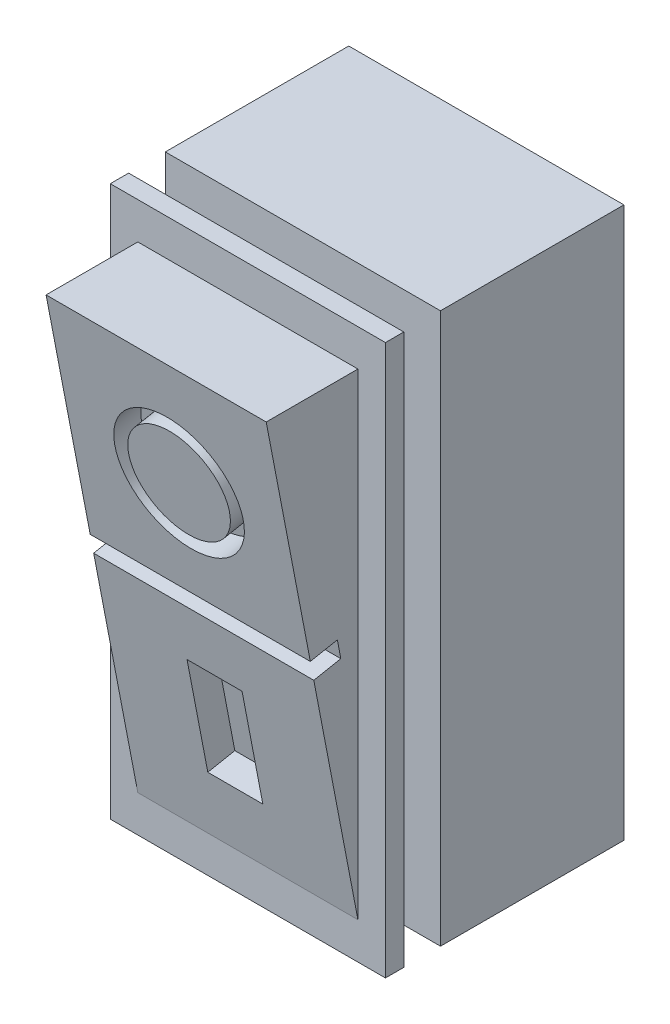
ISO-10303-21;
HEADER;
FILE_DESCRIPTION(('STEP AP214'),'2;1');
FILE_NAME('part.step','',(''),(''),'','','');
FILE_SCHEMA(('AUTOMOTIVE_DESIGN { 1 0 10303 214 1 1 1 1 }'));
ENDSEC;
DATA;
#1=APPLICATION_CONTEXT('core data for automotive mechanical design processes');
#2=APPLICATION_PROTOCOL_DEFINITION('international standard','automotive_design',2000,#1);
#3=PRODUCT_CONTEXT('',#1,'mechanical');
#4=PRODUCT('Part','Part','',(#3));
#5=PRODUCT_RELATED_PRODUCT_CATEGORY('part','',(#4));
#6=PRODUCT_DEFINITION_FORMATION('','',#4);
#7=PRODUCT_DEFINITION_CONTEXT('part definition',#1,'design');
#8=PRODUCT_DEFINITION('design','',#6,#7);
#9=PRODUCT_DEFINITION_SHAPE('','',#8);
#10=(LENGTH_UNIT() NAMED_UNIT(*) SI_UNIT(.MILLI.,.METRE.));
#11=(NAMED_UNIT(*) PLANE_ANGLE_UNIT() SI_UNIT($,.RADIAN.));
#12=(NAMED_UNIT(*) SI_UNIT($,.STERADIAN.) SOLID_ANGLE_UNIT());
#13=UNCERTAINTY_MEASURE_WITH_UNIT(LENGTH_MEASURE(1.E-05),#10,'distance_accuracy_value','');
#14=(GEOMETRIC_REPRESENTATION_CONTEXT(3) GLOBAL_UNCERTAINTY_ASSIGNED_CONTEXT((#13)) GLOBAL_UNIT_ASSIGNED_CONTEXT((#10,
#11,#12)) REPRESENTATION_CONTEXT('',''));
#15=CARTESIAN_POINT('',(0.,0.,0.));
#16=DIRECTION('',(0.,0.,1.));
#17=DIRECTION('',(1.,0.,0.));
#18=AXIS2_PLACEMENT_3D('',#15,#16,#17);
#19=CARTESIAN_POINT('',(-6.,13.,18.));
#20=DIRECTION('',(0.,0.188847393650125,-0.982006446980647));
#21=DIRECTION('',(0.,0.982006446980647,0.188847393650125));
#22=AXIS2_PLACEMENT_3D('',#19,#20,#21);
#23=PLANE('',#22);
#24=CARTESIAN_POINT('',(0.,6.5,16.75));
#25=DIRECTION('',(0.,-0.188847393650124,0.982006446980647));
#26=DIRECTION('',(0.,-0.982006446980647,-0.188847393650124));
#27=AXIS2_PLACEMENT_3D('',#24,#25,#26);
#28=CIRCLE('',#27,3.5);
#29=CARTESIAN_POINT('',(0.,3.06297743556773,16.0890341222246));
#30=VERTEX_POINT('',#29);
#31=EDGE_CURVE('E215',#30,#30,#28,.T.);
#32=ORIENTED_EDGE('',*,*,#31,.F.);
#33=EDGE_LOOP('',(#32));
#34=FACE_BOUND('',#33,.T.);
#35=DIRECTION('',(1.,0.,0.));
#36=VECTOR('',#35,1.);
#37=CARTESIAN_POINT('',(0.,0.491003223490321,15.5944236968251));
#38=LINE('',#37,#36);
#39=CARTESIAN_POINT('',(-6.,0.491003223490321,15.5944236968251));
#40=VERTEX_POINT('',#39);
#41=CARTESIAN_POINT('',(6.,0.491003223490321,15.5944236968251));
#42=VERTEX_POINT('',#41);
#43=EDGE_CURVE('E474',#40,#42,#38,.T.);
#44=ORIENTED_EDGE('',*,*,#43,.T.);
#45=DIRECTION('',(0.,0.982006446980647,0.188847393650125));
#46=VECTOR('',#45,1.);
#47=CARTESIAN_POINT('',(6.,13.,18.));
#48=LINE('',#47,#46);
#49=CARTESIAN_POINT('',(6.,13.,18.));
#50=VERTEX_POINT('',#49);
#51=EDGE_CURVE('E228',#42,#50,#48,.T.);
#52=ORIENTED_EDGE('',*,*,#51,.T.);
#53=DIRECTION('',(-1.,0.,0.));
#54=VECTOR('',#53,1.);
#55=CARTESIAN_POINT('',(-6.,13.,18.));
#56=LINE('',#55,#54);
#57=CARTESIAN_POINT('',(-6.,13.,18.));
#58=VERTEX_POINT('',#57);
#59=EDGE_CURVE('E239',#50,#58,#56,.T.);
#60=ORIENTED_EDGE('',*,*,#59,.T.);
#61=DIRECTION('',(0.,0.982006446980647,0.188847393650125));
#62=VECTOR('',#61,1.);
#63=CARTESIAN_POINT('',(-6.,13.,18.));
#64=LINE('',#63,#62);
#65=EDGE_CURVE('E235',#40,#58,#64,.T.);
#66=ORIENTED_EDGE('',*,*,#65,.F.);
#67=EDGE_LOOP('',(#44,#52,#60,#66));
#68=FACE_BOUND('',#67,.T.);
#69=ADVANCED_FACE('F33',(#34,#68),#23,.F.);
#70=CARTESIAN_POINT('',(6.,-13.,18.));
#71=DIRECTION('',(-1.,0.,0.));
#72=DIRECTION('',(0.,0.,1.));
#73=AXIS2_PLACEMENT_3D('',#70,#71,#72);
#74=PLANE('',#73);
#75=DIRECTION('',(0.,-0.188847393650125,0.982006446980647));
#76=VECTOR('',#75,1.);
#77=CARTESIAN_POINT('',(6.,0.774274313965508,14.1214140263541));
#78=LINE('',#77,#76);
#79=CARTESIAN_POINT('',(6.,0.774274313965508,14.1214140263541));
#80=VERTEX_POINT('',#79);
#81=EDGE_CURVE('E187',#80,#42,#78,.T.);
#82=ORIENTED_EDGE('',*,*,#81,.F.);
#83=DIRECTION('',(0.,0.982006446980647,0.188847393650124));
#84=VECTOR('',#83,1.);
#85=CARTESIAN_POINT('',(6.,-2.59119395945349,13.4742085891581));
#86=LINE('',#85,#84);
#87=CARTESIAN_POINT('',(6.,-0.207732133015141,13.932566632704));
#88=VERTEX_POINT('',#87);
#89=EDGE_CURVE('E173',#88,#80,#86,.T.);
#90=ORIENTED_EDGE('',*,*,#89,.F.);
#91=DIRECTION('',(0.,-0.188847393650125,0.982006446980647));
#92=VECTOR('',#91,1.);
#93=CARTESIAN_POINT('',(6.,-0.207732133015141,13.932566632704));
#94=LINE('',#93,#92);
#95=CARTESIAN_POINT('',(6.,-0.491003223490328,15.4055763031749));
#96=VERTEX_POINT('',#95);
#97=EDGE_CURVE('E171',#88,#96,#94,.T.);
#98=ORIENTED_EDGE('',*,*,#97,.T.);
#99=CARTESIAN_POINT('',(6.,-13.,13.));
#100=VERTEX_POINT('',#99);
#101=EDGE_CURVE('E236',#100,#96,#48,.T.);
#102=ORIENTED_EDGE('',*,*,#101,.F.);
#103=DIRECTION('',(0.,1.,0.));
#104=VECTOR('',#103,1.);
#105=CARTESIAN_POINT('',(6.,-13.,13.));
#106=LINE('',#105,#104);
#107=CARTESIAN_POINT('',(6.,13.,13.));
#108=VERTEX_POINT('',#107);
#109=EDGE_CURVE('E234',#100,#108,#106,.T.);
#110=ORIENTED_EDGE('',*,*,#109,.T.);
#111=DIRECTION('',(0.,0.,-1.));
#112=VECTOR('',#111,1.);
#113=CARTESIAN_POINT('',(6.,13.,18.));
#114=LINE('',#113,#112);
#115=EDGE_CURVE('E254',#50,#108,#114,.T.);
#116=ORIENTED_EDGE('',*,*,#115,.F.);
#117=ORIENTED_EDGE('',*,*,#51,.F.);
#118=EDGE_LOOP('',(#82,#90,#98,#102,#110,#116,#117));
#119=FACE_BOUND('',#118,.T.);
#120=ADVANCED_FACE('F360',(#119),#74,.F.);
#121=CARTESIAN_POINT('',(-6.,-13.,18.));
#122=DIRECTION('',(1.,0.,0.));
#123=DIRECTION('',(0.,0.,-1.));
#124=AXIS2_PLACEMENT_3D('',#121,#122,#123);
#125=PLANE('',#124);
#126=DIRECTION('',(0.,-0.188847393650125,0.982006446980647));
#127=VECTOR('',#126,1.);
#128=CARTESIAN_POINT('',(-6.,0.774274313965508,14.1214140263541));
#129=LINE('',#128,#127);
#130=CARTESIAN_POINT('',(-6.,0.774274313965506,14.1214140263541));
#131=VERTEX_POINT('',#130);
#132=EDGE_CURVE('E185',#131,#40,#129,.T.);
#133=ORIENTED_EDGE('',*,*,#132,.T.);
#134=ORIENTED_EDGE('',*,*,#65,.T.);
#135=DIRECTION('',(0.,0.,-1.));
#136=VECTOR('',#135,1.);
#137=CARTESIAN_POINT('',(-6.,13.,18.));
#138=LINE('',#137,#136);
#139=CARTESIAN_POINT('',(-6.,13.,13.));
#140=VERTEX_POINT('',#139);
#141=EDGE_CURVE('E242',#58,#140,#138,.T.);
#142=ORIENTED_EDGE('',*,*,#141,.T.);
#143=DIRECTION('',(0.,-1.,0.));
#144=VECTOR('',#143,1.);
#145=CARTESIAN_POINT('',(-6.,-13.,13.));
#146=LINE('',#145,#144);
#147=CARTESIAN_POINT('',(-6.,-13.,13.));
#148=VERTEX_POINT('',#147);
#149=EDGE_CURVE('E249',#140,#148,#146,.T.);
#150=ORIENTED_EDGE('',*,*,#149,.T.);
#151=CARTESIAN_POINT('',(-6.,-0.491003223490327,15.4055763031749));
#152=VERTEX_POINT('',#151);
#153=EDGE_CURVE('E184',#148,#152,#64,.T.);
#154=ORIENTED_EDGE('',*,*,#153,.T.);
#155=DIRECTION('',(0.,-0.188847393650125,0.982006446980647));
#156=VECTOR('',#155,1.);
#157=CARTESIAN_POINT('',(-6.,-0.20773213301514,13.932566632704));
#158=LINE('',#157,#156);
#159=CARTESIAN_POINT('',(-6.,-0.20773213301514,13.932566632704));
#160=VERTEX_POINT('',#159);
#161=EDGE_CURVE('E168',#160,#152,#158,.T.);
#162=ORIENTED_EDGE('',*,*,#161,.F.);
#163=DIRECTION('',(0.,-0.982006446980647,-0.188847393650124));
#164=VECTOR('',#163,1.);
#165=CARTESIAN_POINT('',(-6.,-2.59119395945349,13.4742085891581));
#166=LINE('',#165,#164);
#167=EDGE_CURVE('E174',#131,#160,#166,.T.);
#168=ORIENTED_EDGE('',*,*,#167,.F.);
#169=EDGE_LOOP('',(#133,#134,#142,#150,#154,#162,#168));
#170=FACE_BOUND('',#169,.T.);
#171=ADVANCED_FACE('F182',(#170),#125,.F.);
#172=ORIENTED_EDGE('',*,*,#101,.T.);
#173=DIRECTION('',(1.,0.,0.));
#174=VECTOR('',#173,1.);
#175=CARTESIAN_POINT('',(0.,-0.491003223490328,15.4055763031749));
#176=LINE('',#175,#174);
#177=EDGE_CURVE('E477',#152,#96,#176,.T.);
#178=ORIENTED_EDGE('',*,*,#177,.F.);
#179=ORIENTED_EDGE('',*,*,#153,.F.);
#180=DIRECTION('',(1.,0.,0.));
#181=VECTOR('',#180,1.);
#182=CARTESIAN_POINT('',(-6.,-13.,13.));
#183=LINE('',#182,#181);
#184=EDGE_CURVE('E243',#148,#100,#183,.T.);
#185=ORIENTED_EDGE('',*,*,#184,.T.);
#186=EDGE_LOOP('',(#172,#178,#179,#185));
#187=FACE_BOUND('',#186,.T.);
#188=DIRECTION('',(0.,0.982006446980647,0.188847393650124));
#189=VECTOR('',#188,1.);
#190=CARTESIAN_POINT('',(-1.5,-2.87446504992867,14.9472182596291));
#191=LINE('',#190,#189);
#192=CARTESIAN_POINT('',(-1.5,-9.44601934094194,13.6834578190496));
#193=VERTEX_POINT('',#192);
#194=CARTESIAN_POINT('',(-1.5,-3.55398065905806,14.8165421809504));
#195=VERTEX_POINT('',#194);
#196=EDGE_CURVE('E56',#193,#195,#191,.T.);
#197=ORIENTED_EDGE('',*,*,#196,.T.);
#198=DIRECTION('',(-1.,0.,0.));
#199=VECTOR('',#198,1.);
#200=CARTESIAN_POINT('',(0.,-3.55398065905806,14.8165421809504));
#201=LINE('',#200,#199);
#202=CARTESIAN_POINT('',(1.5,-3.55398065905806,14.8165421809504));
#203=VERTEX_POINT('',#202);
#204=EDGE_CURVE('E195',#203,#195,#201,.T.);
#205=ORIENTED_EDGE('',*,*,#204,.F.);
#206=DIRECTION('',(0.,0.982006446980647,0.188847393650124));
#207=VECTOR('',#206,1.);
#208=CARTESIAN_POINT('',(1.5,-2.87446504992867,14.9472182596291));
#209=LINE('',#208,#207);
#210=CARTESIAN_POINT('',(1.5,-9.44601934094194,13.6834578190496));
#211=VERTEX_POINT('',#210);
#212=EDGE_CURVE('E208',#211,#203,#209,.T.);
#213=ORIENTED_EDGE('',*,*,#212,.F.);
#214=DIRECTION('',(-1.,0.,0.));
#215=VECTOR('',#214,1.);
#216=CARTESIAN_POINT('',(0.,-9.44601934094194,13.6834578190496));
#217=LINE('',#216,#215);
#218=EDGE_CURVE('E205',#211,#193,#217,.T.);
#219=ORIENTED_EDGE('',*,*,#218,.T.);
#220=EDGE_LOOP('',(#197,#205,#213,#219));
#221=FACE_BOUND('',#220,.T.);
#222=ADVANCED_FACE('F364',(#187,#221),#23,.F.);
#223=CARTESIAN_POINT('',(0.,0.,13.));
#224=DIRECTION('',(0.,0.,-1.));
#225=DIRECTION('',(-1.,0.,0.));
#226=AXIS2_PLACEMENT_3D('',#223,#224,#225);
#227=PLANE('',#226);
#228=DIRECTION('',(0.,1.,0.));
#229=VECTOR('',#228,1.);
#230=CARTESIAN_POINT('',(7.5,-15.,13.));
#231=LINE('',#230,#229);
#232=CARTESIAN_POINT('',(7.5,-15.,13.));
#233=VERTEX_POINT('',#232);
#234=CARTESIAN_POINT('',(7.5,15.,13.));
#235=VERTEX_POINT('',#234);
#236=EDGE_CURVE('E258',#233,#235,#231,.T.);
#237=ORIENTED_EDGE('',*,*,#236,.T.);
#238=DIRECTION('',(-1.,0.,0.));
#239=VECTOR('',#238,1.);
#240=CARTESIAN_POINT('',(-7.5,15.,13.));
#241=LINE('',#240,#239);
#242=CARTESIAN_POINT('',(-7.5,15.,13.));
#243=VERTEX_POINT('',#242);
#244=EDGE_CURVE('E261',#235,#243,#241,.T.);
#245=ORIENTED_EDGE('',*,*,#244,.T.);
#246=DIRECTION('',(0.,-1.,0.));
#247=VECTOR('',#246,1.);
#248=CARTESIAN_POINT('',(-7.5,-15.,13.));
#249=LINE('',#248,#247);
#250=CARTESIAN_POINT('',(-7.5,-15.,13.));
#251=VERTEX_POINT('',#250);
#252=EDGE_CURVE('E264',#243,#251,#249,.T.);
#253=ORIENTED_EDGE('',*,*,#252,.T.);
#254=DIRECTION('',(1.,0.,0.));
#255=VECTOR('',#254,1.);
#256=CARTESIAN_POINT('',(-7.5,-15.,13.));
#257=LINE('',#256,#255);
#258=EDGE_CURVE('E266',#251,#233,#257,.T.);
#259=ORIENTED_EDGE('',*,*,#258,.T.);
#260=EDGE_LOOP('',(#237,#245,#253,#259));
#261=FACE_BOUND('',#260,.T.);
#262=ORIENTED_EDGE('',*,*,#109,.F.);
#263=ORIENTED_EDGE('',*,*,#184,.F.);
#264=ORIENTED_EDGE('',*,*,#149,.F.);
#265=DIRECTION('',(-1.,0.,0.));
#266=VECTOR('',#265,1.);
#267=CARTESIAN_POINT('',(-6.,13.,13.));
#268=LINE('',#267,#266);
#269=EDGE_CURVE('E246',#108,#140,#268,.T.);
#270=ORIENTED_EDGE('',*,*,#269,.F.);
#271=EDGE_LOOP('',(#262,#263,#264,#270));
#272=FACE_BOUND('',#271,.T.);
#273=ADVANCED_FACE('F340',(#261,#272),#227,.F.);
#274=CARTESIAN_POINT('',(0.,0.,10.));
#275=DIRECTION('',(0.,0.,-1.));
#276=DIRECTION('',(-1.,0.,0.));
#277=AXIS2_PLACEMENT_3D('',#274,#275,#276);
#278=PLANE('',#277);
#279=DIRECTION('',(0.,1.,0.));
#280=VECTOR('',#279,1.);
#281=CARTESIAN_POINT('',(7.5,-15.,10.));
#282=LINE('',#281,#280);
#283=CARTESIAN_POINT('',(7.5,-15.,10.));
#284=VERTEX_POINT('',#283);
#285=CARTESIAN_POINT('',(7.5,15.,10.));
#286=VERTEX_POINT('',#285);
#287=EDGE_CURVE('E291',#284,#286,#282,.T.);
#288=ORIENTED_EDGE('',*,*,#287,.T.);
#289=DIRECTION('',(-1.,0.,0.));
#290=VECTOR('',#289,1.);
#291=CARTESIAN_POINT('',(-7.5,15.,10.));
#292=LINE('',#291,#290);
#293=CARTESIAN_POINT('',(-7.5,15.,10.));
#294=VERTEX_POINT('',#293);
#295=EDGE_CURVE('E294',#286,#294,#292,.T.);
#296=ORIENTED_EDGE('',*,*,#295,.T.);
#297=DIRECTION('',(0.,-1.,0.));
#298=VECTOR('',#297,1.);
#299=CARTESIAN_POINT('',(-7.5,-15.,10.));
#300=LINE('',#299,#298);
#301=CARTESIAN_POINT('',(-7.5,-15.,10.));
#302=VERTEX_POINT('',#301);
#303=EDGE_CURVE('E297',#294,#302,#300,.T.);
#304=ORIENTED_EDGE('',*,*,#303,.T.);
#305=DIRECTION('',(1.,0.,0.));
#306=VECTOR('',#305,1.);
#307=CARTESIAN_POINT('',(-7.5,-15.,10.));
#308=LINE('',#307,#306);
#309=EDGE_CURVE('E299',#302,#284,#308,.T.);
#310=ORIENTED_EDGE('',*,*,#309,.T.);
#311=EDGE_LOOP('',(#288,#296,#304,#310));
#312=FACE_BOUND('',#311,.T.);
#313=CARTESIAN_POINT('',(0.,0.,10.));
#314=DIRECTION('',(0.,0.,-1.));
#315=DIRECTION('',(-1.,0.,0.));
#316=AXIS2_PLACEMENT_3D('',#313,#314,#315);
#317=CIRCLE('',#316,3.75);
#318=CARTESIAN_POINT('',(-3.75,0.,10.));
#319=VERTEX_POINT('',#318);
#320=EDGE_CURVE('E11',#319,#319,#317,.F.);
#321=ORIENTED_EDGE('',*,*,#320,.F.);
#322=EDGE_LOOP('',(#321));
#323=FACE_BOUND('',#322,.T.);
#324=ADVANCED_FACE('F337',(#312,#323),#278,.F.);
#325=CARTESIAN_POINT('',(7.5,-15.,10.));
#326=DIRECTION('',(-1.,0.,0.));
#327=DIRECTION('',(0.,-1.,0.));
#328=AXIS2_PLACEMENT_3D('',#325,#326,#327);
#329=PLANE('',#328);
#330=DIRECTION('',(0.,1.,0.));
#331=VECTOR('',#330,1.);
#332=CARTESIAN_POINT('',(7.5,-15.,0.));
#333=LINE('',#332,#331);
#334=CARTESIAN_POINT('',(7.5,-15.,0.));
#335=VERTEX_POINT('',#334);
#336=CARTESIAN_POINT('',(7.5,15.,0.));
#337=VERTEX_POINT('',#336);
#338=EDGE_CURVE('E290',#335,#337,#333,.T.);
#339=ORIENTED_EDGE('',*,*,#338,.T.);
#340=DIRECTION('',(0.,0.,-1.));
#341=VECTOR('',#340,1.);
#342=CARTESIAN_POINT('',(7.5,15.,10.));
#343=LINE('',#342,#341);
#344=EDGE_CURVE('E41',#286,#337,#343,.T.);
#345=ORIENTED_EDGE('',*,*,#344,.F.);
#346=ORIENTED_EDGE('',*,*,#287,.F.);
#347=DIRECTION('',(0.,0.,-1.));
#348=VECTOR('',#347,1.);
#349=CARTESIAN_POINT('',(7.5,-15.,10.));
#350=LINE('',#349,#348);
#351=EDGE_CURVE('E301',#284,#335,#350,.T.);
#352=ORIENTED_EDGE('',*,*,#351,.T.);
#353=EDGE_LOOP('',(#339,#345,#346,#352));
#354=FACE_BOUND('',#353,.T.);
#355=ADVANCED_FACE('F35',(#354),#329,.F.);
#356=CARTESIAN_POINT('',(-7.5,15.,10.));
#357=DIRECTION('',(0.,-1.,0.));
#358=DIRECTION('',(0.,0.,-1.));
#359=AXIS2_PLACEMENT_3D('',#356,#357,#358);
#360=PLANE('',#359);
#361=DIRECTION('',(-1.,0.,0.));
#362=VECTOR('',#361,1.);
#363=CARTESIAN_POINT('',(-7.5,15.,0.));
#364=LINE('',#363,#362);
#365=CARTESIAN_POINT('',(-7.5,15.,0.));
#366=VERTEX_POINT('',#365);
#367=EDGE_CURVE('E304',#337,#366,#364,.T.);
#368=ORIENTED_EDGE('',*,*,#367,.T.);
#369=DIRECTION('',(0.,0.,-1.));
#370=VECTOR('',#369,1.);
#371=CARTESIAN_POINT('',(-7.5,15.,10.));
#372=LINE('',#371,#370);
#373=EDGE_CURVE('E314',#294,#366,#372,.T.);
#374=ORIENTED_EDGE('',*,*,#373,.F.);
#375=ORIENTED_EDGE('',*,*,#295,.F.);
#376=ORIENTED_EDGE('',*,*,#344,.T.);
#377=EDGE_LOOP('',(#368,#374,#375,#376));
#378=FACE_BOUND('',#377,.T.);
#379=ADVANCED_FACE('F319',(#378),#360,.F.);
#380=CARTESIAN_POINT('',(-7.5,-15.,10.));
#381=DIRECTION('',(1.,0.,0.));
#382=DIRECTION('',(0.,0.,-1.));
#383=AXIS2_PLACEMENT_3D('',#380,#381,#382);
#384=PLANE('',#383);
#385=DIRECTION('',(0.,-1.,0.));
#386=VECTOR('',#385,1.);
#387=CARTESIAN_POINT('',(-7.5,-15.,0.));
#388=LINE('',#387,#386);
#389=CARTESIAN_POINT('',(-7.5,-15.,0.));
#390=VERTEX_POINT('',#389);
#391=EDGE_CURVE('E306',#366,#390,#388,.T.);
#392=ORIENTED_EDGE('',*,*,#391,.T.);
#393=DIRECTION('',(0.,0.,-1.));
#394=VECTOR('',#393,1.);
#395=CARTESIAN_POINT('',(-7.5,-15.,10.));
#396=LINE('',#395,#394);
#397=EDGE_CURVE('E311',#302,#390,#396,.T.);
#398=ORIENTED_EDGE('',*,*,#397,.F.);
#399=ORIENTED_EDGE('',*,*,#303,.F.);
#400=ORIENTED_EDGE('',*,*,#373,.T.);
#401=EDGE_LOOP('',(#392,#398,#399,#400));
#402=FACE_BOUND('',#401,.T.);
#403=ADVANCED_FACE('F331',(#402),#384,.F.);
#404=CARTESIAN_POINT('',(-7.5,-15.,10.));
#405=DIRECTION('',(0.,1.,0.));
#406=DIRECTION('',(0.,0.,1.));
#407=AXIS2_PLACEMENT_3D('',#404,#405,#406);
#408=PLANE('',#407);
#409=DIRECTION('',(1.,0.,0.));
#410=VECTOR('',#409,1.);
#411=CARTESIAN_POINT('',(-7.5,-15.,0.));
#412=LINE('',#411,#410);
#413=EDGE_CURVE('E295',#390,#335,#412,.T.);
#414=ORIENTED_EDGE('',*,*,#413,.T.);
#415=ORIENTED_EDGE('',*,*,#351,.F.);
#416=ORIENTED_EDGE('',*,*,#309,.F.);
#417=ORIENTED_EDGE('',*,*,#397,.T.);
#418=EDGE_LOOP('',(#414,#415,#416,#417));
#419=FACE_BOUND('',#418,.T.);
#420=ADVANCED_FACE('F335',(#419),#408,.F.);
#421=CARTESIAN_POINT('',(0.,0.,0.));
#422=DIRECTION('',(0.,0.,-1.));
#423=DIRECTION('',(-1.,0.,0.));
#424=AXIS2_PLACEMENT_3D('',#421,#422,#423);
#425=PLANE('',#424);
#426=ORIENTED_EDGE('',*,*,#338,.F.);
#427=ORIENTED_EDGE('',*,*,#413,.F.);
#428=ORIENTED_EDGE('',*,*,#391,.F.);
#429=ORIENTED_EDGE('',*,*,#367,.F.);
#430=EDGE_LOOP('',(#426,#427,#428,#429));
#431=FACE_BOUND('',#430,.T.);
#432=ADVANCED_FACE('F327',(#431),#425,.T.);
#433=CARTESIAN_POINT('',(0.,0.,12.));
#434=DIRECTION('',(0.,0.,-1.));
#435=DIRECTION('',(-1.,0.,0.));
#436=AXIS2_PLACEMENT_3D('',#433,#434,#435);
#437=CYLINDRICAL_SURFACE('',#436,3.75);
#438=CARTESIAN_POINT('',(0.,0.,12.));
#439=DIRECTION('',(0.,0.,1.));
#440=DIRECTION('',(1.,0.,0.));
#441=AXIS2_PLACEMENT_3D('',#438,#439,#440);
#442=CIRCLE('',#441,3.75);
#443=CARTESIAN_POINT('',(3.75,0.,12.));
#444=VERTEX_POINT('',#443);
#445=EDGE_CURVE('E287',#444,#444,#442,.T.);
#446=ORIENTED_EDGE('',*,*,#445,.F.);
#447=EDGE_LOOP('',(#446));
#448=FACE_BOUND('',#447,.T.);
#449=ORIENTED_EDGE('',*,*,#320,.T.);
#450=EDGE_LOOP('',(#449));
#451=FACE_BOUND('',#450,.T.);
#452=ADVANCED_FACE('F344',(#448,#451),#437,.T.);
#453=CARTESIAN_POINT('',(0.,0.,12.));
#454=DIRECTION('',(0.,0.,-1.));
#455=DIRECTION('',(-1.,0.,0.));
#456=AXIS2_PLACEMENT_3D('',#453,#454,#455);
#457=PLANE('',#456);
#458=DIRECTION('',(0.,1.,0.));
#459=VECTOR('',#458,1.);
#460=CARTESIAN_POINT('',(7.5,-15.,12.));
#461=LINE('',#460,#459);
#462=CARTESIAN_POINT('',(7.5,-15.,12.));
#463=VERTEX_POINT('',#462);
#464=CARTESIAN_POINT('',(7.5,15.,12.));
#465=VERTEX_POINT('',#464);
#466=EDGE_CURVE('E257',#463,#465,#461,.T.);
#467=ORIENTED_EDGE('',*,*,#466,.F.);
#468=DIRECTION('',(1.,0.,0.));
#469=VECTOR('',#468,1.);
#470=CARTESIAN_POINT('',(-7.5,-15.,12.));
#471=LINE('',#470,#469);
#472=CARTESIAN_POINT('',(-7.5,-15.,12.));
#473=VERTEX_POINT('',#472);
#474=EDGE_CURVE('E262',#473,#463,#471,.T.);
#475=ORIENTED_EDGE('',*,*,#474,.F.);
#476=DIRECTION('',(0.,-1.,0.));
#477=VECTOR('',#476,1.);
#478=CARTESIAN_POINT('',(-7.5,-15.,12.));
#479=LINE('',#478,#477);
#480=CARTESIAN_POINT('',(-7.5,15.,12.));
#481=VERTEX_POINT('',#480);
#482=EDGE_CURVE('E273',#481,#473,#479,.T.);
#483=ORIENTED_EDGE('',*,*,#482,.F.);
#484=DIRECTION('',(-1.,0.,0.));
#485=VECTOR('',#484,1.);
#486=CARTESIAN_POINT('',(-7.5,15.,12.));
#487=LINE('',#486,#485);
#488=EDGE_CURVE('E271',#465,#481,#487,.T.);
#489=ORIENTED_EDGE('',*,*,#488,.F.);
#490=EDGE_LOOP('',(#467,#475,#483,#489));
#491=FACE_BOUND('',#490,.T.);
#492=ORIENTED_EDGE('',*,*,#445,.T.);
#493=EDGE_LOOP('',(#492));
#494=FACE_BOUND('',#493,.T.);
#495=ADVANCED_FACE('F346',(#491,#494),#457,.T.);
#496=CARTESIAN_POINT('',(7.5,-15.,13.));
#497=DIRECTION('',(-1.,0.,0.));
#498=DIRECTION('',(0.,0.,1.));
#499=AXIS2_PLACEMENT_3D('',#496,#497,#498);
#500=PLANE('',#499);
#501=ORIENTED_EDGE('',*,*,#466,.T.);
#502=DIRECTION('',(0.,0.,-1.));
#503=VECTOR('',#502,1.);
#504=CARTESIAN_POINT('',(7.5,15.,13.));
#505=LINE('',#504,#503);
#506=EDGE_CURVE('E284',#235,#465,#505,.T.);
#507=ORIENTED_EDGE('',*,*,#506,.F.);
#508=ORIENTED_EDGE('',*,*,#236,.F.);
#509=DIRECTION('',(0.,0.,-1.));
#510=VECTOR('',#509,1.);
#511=CARTESIAN_POINT('',(7.5,-15.,13.));
#512=LINE('',#511,#510);
#513=EDGE_CURVE('E268',#233,#463,#512,.T.);
#514=ORIENTED_EDGE('',*,*,#513,.T.);
#515=EDGE_LOOP('',(#501,#507,#508,#514));
#516=FACE_BOUND('',#515,.T.);
#517=ADVANCED_FACE('F353',(#516),#500,.F.);
#518=CARTESIAN_POINT('',(-7.5,15.,13.));
#519=DIRECTION('',(0.,-1.,0.));
#520=DIRECTION('',(0.,0.,-1.));
#521=AXIS2_PLACEMENT_3D('',#518,#519,#520);
#522=PLANE('',#521);
#523=ORIENTED_EDGE('',*,*,#488,.T.);
#524=DIRECTION('',(0.,0.,-1.));
#525=VECTOR('',#524,1.);
#526=CARTESIAN_POINT('',(-7.5,15.,13.));
#527=LINE('',#526,#525);
#528=EDGE_CURVE('E281',#243,#481,#527,.T.);
#529=ORIENTED_EDGE('',*,*,#528,.F.);
#530=ORIENTED_EDGE('',*,*,#244,.F.);
#531=ORIENTED_EDGE('',*,*,#506,.T.);
#532=EDGE_LOOP('',(#523,#529,#530,#531));
#533=FACE_BOUND('',#532,.T.);
#534=ADVANCED_FACE('F447',(#533),#522,.F.);
#535=CARTESIAN_POINT('',(-7.5,-15.,13.));
#536=DIRECTION('',(1.,0.,0.));
#537=DIRECTION('',(0.,0.,-1.));
#538=AXIS2_PLACEMENT_3D('',#535,#536,#537);
#539=PLANE('',#538);
#540=ORIENTED_EDGE('',*,*,#482,.T.);
#541=DIRECTION('',(0.,0.,-1.));
#542=VECTOR('',#541,1.);
#543=CARTESIAN_POINT('',(-7.5,-15.,13.));
#544=LINE('',#543,#542);
#545=EDGE_CURVE('E278',#251,#473,#544,.T.);
#546=ORIENTED_EDGE('',*,*,#545,.F.);
#547=ORIENTED_EDGE('',*,*,#252,.F.);
#548=ORIENTED_EDGE('',*,*,#528,.T.);
#549=EDGE_LOOP('',(#540,#546,#547,#548));
#550=FACE_BOUND('',#549,.T.);
#551=ADVANCED_FACE('F441',(#550),#539,.F.);
#552=CARTESIAN_POINT('',(-7.5,-15.,13.));
#553=DIRECTION('',(0.,1.,0.));
#554=DIRECTION('',(0.,0.,1.));
#555=AXIS2_PLACEMENT_3D('',#552,#553,#554);
#556=PLANE('',#555);
#557=ORIENTED_EDGE('',*,*,#474,.T.);
#558=ORIENTED_EDGE('',*,*,#513,.F.);
#559=ORIENTED_EDGE('',*,*,#258,.F.);
#560=ORIENTED_EDGE('',*,*,#545,.T.);
#561=EDGE_LOOP('',(#557,#558,#559,#560));
#562=FACE_BOUND('',#561,.T.);
#563=ADVANCED_FACE('F429',(#562),#556,.F.);
#564=CARTESIAN_POINT('',(-6.,13.,18.));
#565=DIRECTION('',(0.,-1.,0.));
#566=DIRECTION('',(0.,0.,-1.));
#567=AXIS2_PLACEMENT_3D('',#564,#565,#566);
#568=PLANE('',#567);
#569=ORIENTED_EDGE('',*,*,#269,.T.);
#570=ORIENTED_EDGE('',*,*,#141,.F.);
#571=ORIENTED_EDGE('',*,*,#59,.F.);
#572=ORIENTED_EDGE('',*,*,#115,.T.);
#573=EDGE_LOOP('',(#569,#570,#571,#572));
#574=FACE_BOUND('',#573,.T.);
#575=ADVANCED_FACE('F424',(#574),#568,.F.);
#576=CARTESIAN_POINT('',(0.,6.78327109047518,15.276990329529));
#577=DIRECTION('',(0.,-0.188847393650125,0.982006446980647));
#578=DIRECTION('',(0.,-0.982006446980647,-0.188847393650125));
#579=AXIS2_PLACEMENT_3D('',#576,#577,#578);
#580=CYLINDRICAL_SURFACE('',#579,3.5);
#581=CARTESIAN_POINT('',(0.,6.78327109047518,15.276990329529));
#582=DIRECTION('',(0.,-0.188847393650124,0.982006446980647));
#583=DIRECTION('',(0.,-0.982006446980647,-0.188847393650124));
#584=AXIS2_PLACEMENT_3D('',#581,#582,#583);
#585=CIRCLE('',#584,3.5);
#586=CARTESIAN_POINT('',(0.,3.34624852604292,14.6160244517536));
#587=VERTEX_POINT('',#586);
#588=EDGE_CURVE('E221',#587,#587,#585,.T.);
#589=ORIENTED_EDGE('',*,*,#588,.F.);
#590=EDGE_LOOP('',(#589));
#591=FACE_BOUND('',#590,.T.);
#592=ORIENTED_EDGE('',*,*,#31,.T.);
#593=EDGE_LOOP('',(#592));
#594=FACE_BOUND('',#593,.T.);
#595=ADVANCED_FACE('F421',(#591,#594),#580,.F.);
#596=CARTESIAN_POINT('',(0.,6.78327109047518,15.276990329529));
#597=DIRECTION('',(0.,-0.188847393650125,0.982006446980647));
#598=DIRECTION('',(0.,-0.982006446980647,-0.188847393650125));
#599=AXIS2_PLACEMENT_3D('',#596,#597,#598);
#600=CYLINDRICAL_SURFACE('',#599,2.75);
#601=CARTESIAN_POINT('',(0.,6.78327109047518,15.276990329529));
#602=DIRECTION('',(0.,-0.188847393650124,0.982006446980647));
#603=DIRECTION('',(0.,-0.982006446980647,-0.188847393650124));
#604=AXIS2_PLACEMENT_3D('',#601,#602,#603);
#605=CIRCLE('',#604,2.75);
#606=CARTESIAN_POINT('',(0.,4.0827533612784,14.7576599969912));
#607=VERTEX_POINT('',#606);
#608=EDGE_CURVE('E224',#607,#607,#605,.T.);
#609=ORIENTED_EDGE('',*,*,#608,.T.);
#610=EDGE_LOOP('',(#609));
#611=FACE_BOUND('',#610,.T.);
#612=CARTESIAN_POINT('',(0.,6.5,16.75));
#613=DIRECTION('',(0.,-0.188847393650124,0.982006446980647));
#614=DIRECTION('',(0.,-0.982006446980647,-0.188847393650124));
#615=AXIS2_PLACEMENT_3D('',#612,#613,#614);
#616=CIRCLE('',#615,2.75);
#617=CARTESIAN_POINT('',(0.,3.79948227080322,16.2306696674622));
#618=VERTEX_POINT('',#617);
#619=EDGE_CURVE('E225',#618,#618,#616,.T.);
#620=ORIENTED_EDGE('',*,*,#619,.F.);
#621=EDGE_LOOP('',(#620));
#622=FACE_BOUND('',#621,.T.);
#623=ADVANCED_FACE('F418',(#611,#622),#600,.T.);
#624=CARTESIAN_POINT('',(0.,-2.59119395945349,13.4742085891581));
#625=DIRECTION('',(0.,-0.188847393650124,0.982006446980647));
#626=DIRECTION('',(0.,-0.982006446980647,-0.188847393650124));
#627=AXIS2_PLACEMENT_3D('',#624,#625,#626);
#628=PLANE('',#627);
#629=ORIENTED_EDGE('',*,*,#588,.T.);
#630=EDGE_LOOP('',(#629));
#631=FACE_BOUND('',#630,.T.);
#632=ORIENTED_EDGE('',*,*,#608,.F.);
#633=EDGE_LOOP('',(#632));
#634=FACE_BOUND('',#633,.T.);
#635=ADVANCED_FACE('F376',(#631,#634),#628,.T.);
#636=ORIENTED_EDGE('',*,*,#619,.T.);
#637=EDGE_LOOP('',(#636));
#638=FACE_BOUND('',#637,.T.);
#639=ADVANCED_FACE('F363',(#638),#23,.F.);
#640=CARTESIAN_POINT('',(-1.5,-2.59119395945349,13.4742085891581));
#641=DIRECTION('',(1.,0.,0.));
#642=DIRECTION('',(0.,0.,-1.));
#643=AXIS2_PLACEMENT_3D('',#640,#641,#642);
#644=PLANE('',#643);
#645=ORIENTED_EDGE('',*,*,#196,.F.);
#646=DIRECTION('',(0.,-0.188847393650125,0.982006446980647));
#647=VECTOR('',#646,1.);
#648=CARTESIAN_POINT('',(-1.5,-9.16274825046676,12.2104481485787));
#649=LINE('',#648,#647);
#650=CARTESIAN_POINT('',(-1.5,-9.16274825046676,12.2104481485787));
#651=VERTEX_POINT('',#650);
#652=EDGE_CURVE('E203',#651,#193,#649,.T.);
#653=ORIENTED_EDGE('',*,*,#652,.F.);
#654=DIRECTION('',(0.,0.982006446980647,0.188847393650124));
#655=VECTOR('',#654,1.);
#656=CARTESIAN_POINT('',(-1.5,-2.59119395945349,13.4742085891581));
#657=LINE('',#656,#655);
#658=CARTESIAN_POINT('',(-1.5,-3.27070956858287,13.3435325104794));
#659=VERTEX_POINT('',#658);
#660=EDGE_CURVE('E192',#651,#659,#657,.T.);
#661=ORIENTED_EDGE('',*,*,#660,.T.);
#662=DIRECTION('',(0.,-0.188847393650125,0.982006446980647));
#663=VECTOR('',#662,1.);
#664=CARTESIAN_POINT('',(-1.5,-3.27070956858287,13.3435325104794));
#665=LINE('',#664,#663);
#666=EDGE_CURVE('E213',#659,#195,#665,.T.);
#667=ORIENTED_EDGE('',*,*,#666,.T.);
#668=EDGE_LOOP('',(#645,#653,#661,#667));
#669=FACE_BOUND('',#668,.T.);
#670=ADVANCED_FACE('F375',(#669),#644,.T.);
#671=CARTESIAN_POINT('',(0.,-3.27070956858287,13.3435325104794));
#672=DIRECTION('',(0.,0.982006446980647,0.188847393650125));
#673=DIRECTION('',(0.,-0.188847393650125,0.982006446980647));
#674=AXIS2_PLACEMENT_3D('',#671,#672,#673);
#675=PLANE('',#674);
#676=ORIENTED_EDGE('',*,*,#204,.T.);
#677=ORIENTED_EDGE('',*,*,#666,.F.);
#678=DIRECTION('',(-1.,0.,0.));
#679=VECTOR('',#678,1.);
#680=CARTESIAN_POINT('',(0.,-3.27070956858287,13.3435325104794));
#681=LINE('',#680,#679);
#682=CARTESIAN_POINT('',(1.5,-3.27070956858287,13.3435325104794));
#683=VERTEX_POINT('',#682);
#684=EDGE_CURVE('E200',#683,#659,#681,.T.);
#685=ORIENTED_EDGE('',*,*,#684,.F.);
#686=DIRECTION('',(0.,-0.188847393650125,0.982006446980647));
#687=VECTOR('',#686,1.);
#688=CARTESIAN_POINT('',(1.5,-3.27070956858287,13.3435325104794));
#689=LINE('',#688,#687);
#690=EDGE_CURVE('E216',#683,#203,#689,.T.);
#691=ORIENTED_EDGE('',*,*,#690,.T.);
#692=EDGE_LOOP('',(#676,#677,#685,#691));
#693=FACE_BOUND('',#692,.T.);
#694=ADVANCED_FACE('F401',(#693),#675,.F.);
#695=CARTESIAN_POINT('',(1.5,-2.59119395945349,13.4742085891581));
#696=DIRECTION('',(1.,0.,0.));
#697=DIRECTION('',(0.,0.,-1.));
#698=AXIS2_PLACEMENT_3D('',#695,#696,#697);
#699=PLANE('',#698);
#700=ORIENTED_EDGE('',*,*,#212,.T.);
#701=ORIENTED_EDGE('',*,*,#690,.F.);
#702=DIRECTION('',(0.,0.982006446980647,0.188847393650124));
#703=VECTOR('',#702,1.);
#704=CARTESIAN_POINT('',(1.5,-2.59119395945349,13.4742085891581));
#705=LINE('',#704,#703);
#706=CARTESIAN_POINT('',(1.5,-9.16274825046676,12.2104481485787));
#707=VERTEX_POINT('',#706);
#708=EDGE_CURVE('E197',#707,#683,#705,.T.);
#709=ORIENTED_EDGE('',*,*,#708,.F.);
#710=DIRECTION('',(0.,-0.188847393650125,0.982006446980647));
#711=VECTOR('',#710,1.);
#712=CARTESIAN_POINT('',(1.5,-9.16274825046676,12.2104481485787));
#713=LINE('',#712,#711);
#714=EDGE_CURVE('E218',#707,#211,#713,.T.);
#715=ORIENTED_EDGE('',*,*,#714,.T.);
#716=EDGE_LOOP('',(#700,#701,#709,#715));
#717=FACE_BOUND('',#716,.T.);
#718=ADVANCED_FACE('F403',(#717),#699,.F.);
#719=CARTESIAN_POINT('',(0.,-9.16274825046676,12.2104481485787));
#720=DIRECTION('',(0.,0.982006446980647,0.188847393650125));
#721=DIRECTION('',(0.,-0.188847393650125,0.982006446980647));
#722=AXIS2_PLACEMENT_3D('',#719,#720,#721);
#723=PLANE('',#722);
#724=ORIENTED_EDGE('',*,*,#218,.F.);
#725=ORIENTED_EDGE('',*,*,#714,.F.);
#726=DIRECTION('',(-1.,0.,0.));
#727=VECTOR('',#726,1.);
#728=CARTESIAN_POINT('',(0.,-9.16274825046676,12.2104481485787));
#729=LINE('',#728,#727);
#730=EDGE_CURVE('E194',#707,#651,#729,.T.);
#731=ORIENTED_EDGE('',*,*,#730,.T.);
#732=ORIENTED_EDGE('',*,*,#652,.T.);
#733=EDGE_LOOP('',(#724,#725,#731,#732));
#734=FACE_BOUND('',#733,.T.);
#735=ADVANCED_FACE('F392',(#734),#723,.T.);
#736=CARTESIAN_POINT('',(0.,-2.59119395945349,13.4742085891581));
#737=DIRECTION('',(0.,-0.188847393650124,0.982006446980647));
#738=DIRECTION('',(0.,-0.982006446980647,-0.188847393650124));
#739=AXIS2_PLACEMENT_3D('',#736,#737,#738);
#740=PLANE('',#739);
#741=ORIENTED_EDGE('',*,*,#660,.F.);
#742=ORIENTED_EDGE('',*,*,#730,.F.);
#743=ORIENTED_EDGE('',*,*,#708,.T.);
#744=ORIENTED_EDGE('',*,*,#684,.T.);
#745=EDGE_LOOP('',(#741,#742,#743,#744));
#746=FACE_BOUND('',#745,.T.);
#747=ADVANCED_FACE('F397',(#746),#740,.T.);
#748=CARTESIAN_POINT('',(0.,0.774274313965508,14.1214140263541));
#749=DIRECTION('',(0.,-0.982006446980647,-0.188847393650125));
#750=DIRECTION('',(0.,0.188847393650125,-0.982006446980647));
#751=AXIS2_PLACEMENT_3D('',#748,#749,#750);
#752=PLANE('',#751);
#753=ORIENTED_EDGE('',*,*,#43,.F.);
#754=ORIENTED_EDGE('',*,*,#132,.F.);
#755=DIRECTION('',(1.,0.,0.));
#756=VECTOR('',#755,1.);
#757=CARTESIAN_POINT('',(0.,0.774274313965508,14.1214140263541));
#758=LINE('',#757,#756);
#759=EDGE_CURVE('E48',#131,#80,#758,.T.);
#760=ORIENTED_EDGE('',*,*,#759,.T.);
#761=ORIENTED_EDGE('',*,*,#81,.T.);
#762=EDGE_LOOP('',(#753,#754,#760,#761));
#763=FACE_BOUND('',#762,.T.);
#764=ADVANCED_FACE('F479',(#763),#752,.T.);
#765=CARTESIAN_POINT('',(0.,-0.207732133015141,13.932566632704));
#766=DIRECTION('',(0.,-0.982006446980647,-0.188847393650125));
#767=DIRECTION('',(0.,0.188847393650125,-0.982006446980647));
#768=AXIS2_PLACEMENT_3D('',#765,#766,#767);
#769=PLANE('',#768);
#770=ORIENTED_EDGE('',*,*,#177,.T.);
#771=ORIENTED_EDGE('',*,*,#97,.F.);
#772=DIRECTION('',(1.,0.,0.));
#773=VECTOR('',#772,1.);
#774=CARTESIAN_POINT('',(0.,-0.207732133015141,13.932566632704));
#775=LINE('',#774,#773);
#776=EDGE_CURVE('E165',#160,#88,#775,.T.);
#777=ORIENTED_EDGE('',*,*,#776,.F.);
#778=ORIENTED_EDGE('',*,*,#161,.T.);
#779=EDGE_LOOP('',(#770,#771,#777,#778));
#780=FACE_BOUND('',#779,.T.);
#781=ADVANCED_FACE('F166',(#780),#769,.F.);
#782=CARTESIAN_POINT('',(0.,-2.59119395945349,13.4742085891581));
#783=DIRECTION('',(0.,-0.188847393650124,0.982006446980647));
#784=DIRECTION('',(0.,-0.982006446980647,-0.188847393650124));
#785=AXIS2_PLACEMENT_3D('',#782,#783,#784);
#786=PLANE('',#785);
#787=ORIENTED_EDGE('',*,*,#759,.F.);
#788=ORIENTED_EDGE('',*,*,#167,.T.);
#789=ORIENTED_EDGE('',*,*,#776,.T.);
#790=ORIENTED_EDGE('',*,*,#89,.T.);
#791=EDGE_LOOP('',(#787,#788,#789,#790));
#792=FACE_BOUND('',#791,.T.);
#793=ADVANCED_FACE('F177',(#792),#786,.T.);
#794=CLOSED_SHELL('',(#69,#120,#171,#222,#273,#324,#355,#379,#403,#420,#432,#452,#495,#517,#534,
#551,#563,#575,#595,#623,#635,#639,#670,#694,#718,#735,#747,#764,#781,#793));
#795=MANIFOLD_SOLID_BREP('B2',#794);
#796=ADVANCED_BREP_SHAPE_REPRESENTATION('',(#18,#795),#14);
#797=SHAPE_DEFINITION_REPRESENTATION(#9,#796);
ENDSEC;
END-ISO-10303-21;
